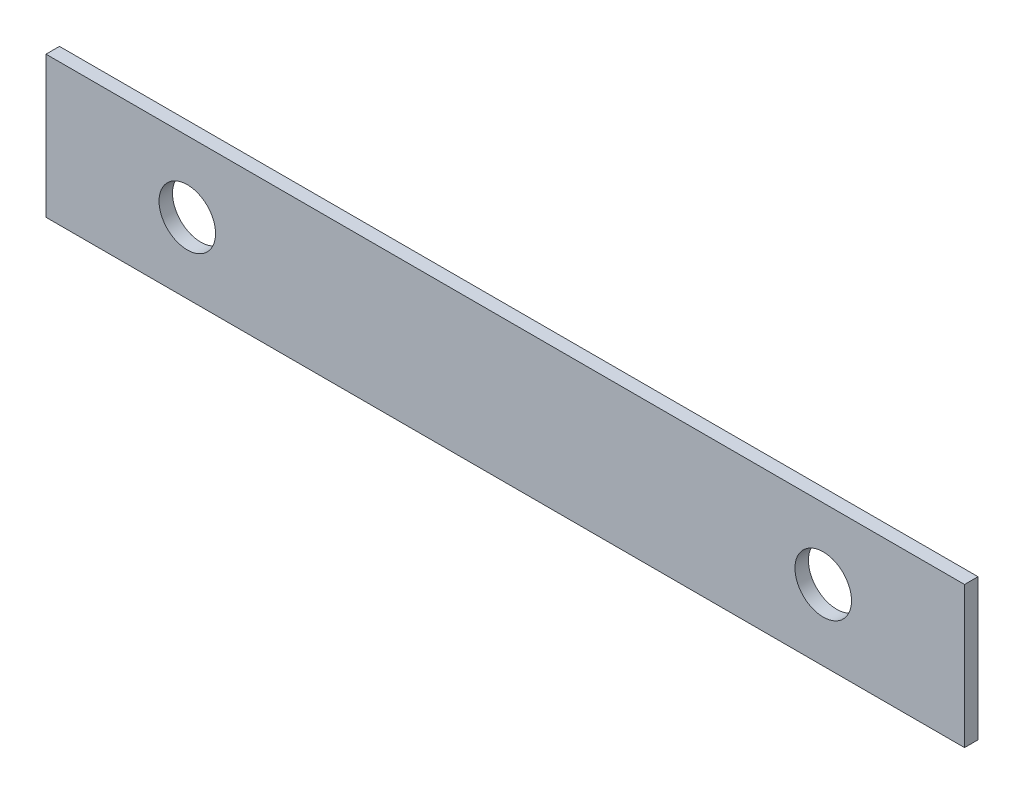
ISO-10303-21;
HEADER;
FILE_DESCRIPTION(('STEP AP214'),'2;1');
FILE_NAME('part.step','',(''),(''),'','','');
FILE_SCHEMA(('AUTOMOTIVE_DESIGN { 1 0 10303 214 1 1 1 1 }'));
ENDSEC;
DATA;
#1=APPLICATION_CONTEXT('core data for automotive mechanical design processes');
#2=APPLICATION_PROTOCOL_DEFINITION('international standard','automotive_design',2000,#1);
#3=PRODUCT_CONTEXT('',#1,'mechanical');
#4=PRODUCT('Part','Part','',(#3));
#5=PRODUCT_RELATED_PRODUCT_CATEGORY('part','',(#4));
#6=PRODUCT_DEFINITION_FORMATION('','',#4);
#7=PRODUCT_DEFINITION_CONTEXT('part definition',#1,'design');
#8=PRODUCT_DEFINITION('design','',#6,#7);
#9=PRODUCT_DEFINITION_SHAPE('','',#8);
#10=(LENGTH_UNIT() NAMED_UNIT(*) SI_UNIT(.MILLI.,.METRE.));
#11=(NAMED_UNIT(*) PLANE_ANGLE_UNIT() SI_UNIT($,.RADIAN.));
#12=(NAMED_UNIT(*) SI_UNIT($,.STERADIAN.) SOLID_ANGLE_UNIT());
#13=UNCERTAINTY_MEASURE_WITH_UNIT(LENGTH_MEASURE(1.E-05),#10,'distance_accuracy_value','');
#14=(GEOMETRIC_REPRESENTATION_CONTEXT(3) GLOBAL_UNCERTAINTY_ASSIGNED_CONTEXT((#13)) GLOBAL_UNIT_ASSIGNED_CONTEXT((#10,
#11,#12)) REPRESENTATION_CONTEXT('',''));
#15=CARTESIAN_POINT('',(0.,0.,0.));
#16=DIRECTION('',(0.,0.,1.));
#17=DIRECTION('',(1.,0.,0.));
#18=AXIS2_PLACEMENT_3D('',#15,#16,#17);
#19=CARTESIAN_POINT('',(324.999999999999,-50.0000000000003,4.765));
#20=DIRECTION('',(-1.,0.,0.));
#21=DIRECTION('',(0.,0.,1.));
#22=AXIS2_PLACEMENT_3D('',#19,#20,#21);
#23=PLANE('',#22);
#24=DIRECTION('',(0.,1.,0.));
#25=VECTOR('',#24,1.);
#26=CARTESIAN_POINT('',(324.999999999999,-50.0000000000003,-4.765));
#27=LINE('',#26,#25);
#28=CARTESIAN_POINT('',(324.999999999999,-50.0000000000003,-4.765));
#29=VERTEX_POINT('',#28);
#30=CARTESIAN_POINT('',(324.999999999999,49.9999999999998,-4.765));
#31=VERTEX_POINT('',#30);
#32=EDGE_CURVE('E99',#29,#31,#27,.T.);
#33=ORIENTED_EDGE('',*,*,#32,.T.);
#34=DIRECTION('',(0.,0.,-1.));
#35=VECTOR('',#34,1.);
#36=CARTESIAN_POINT('',(324.999999999999,49.9999999999998,4.765));
#37=LINE('',#36,#35);
#38=CARTESIAN_POINT('',(324.999999999999,49.9999999999998,4.765));
#39=VERTEX_POINT('',#38);
#40=EDGE_CURVE('E11',#39,#31,#37,.T.);
#41=ORIENTED_EDGE('',*,*,#40,.F.);
#42=DIRECTION('',(0.,1.,0.));
#43=VECTOR('',#42,1.);
#44=CARTESIAN_POINT('',(324.999999999999,-50.0000000000003,4.765));
#45=LINE('',#44,#43);
#46=CARTESIAN_POINT('',(324.999999999999,-50.0000000000003,4.765));
#47=VERTEX_POINT('',#46);
#48=EDGE_CURVE('E86',#47,#39,#45,.T.);
#49=ORIENTED_EDGE('',*,*,#48,.F.);
#50=DIRECTION('',(0.,0.,-1.));
#51=VECTOR('',#50,1.);
#52=CARTESIAN_POINT('',(324.999999999999,-50.0000000000003,4.765));
#53=LINE('',#52,#51);
#54=EDGE_CURVE('E95',#47,#29,#53,.T.);
#55=ORIENTED_EDGE('',*,*,#54,.T.);
#56=EDGE_LOOP('',(#33,#41,#49,#55));
#57=FACE_BOUND('',#56,.T.);
#58=ADVANCED_FACE('F34',(#57),#23,.F.);
#59=CARTESIAN_POINT('',(-325.000000000001,49.9999999999998,4.765));
#60=DIRECTION('',(0.,-1.,0.));
#61=DIRECTION('',(0.,0.,-1.));
#62=AXIS2_PLACEMENT_3D('',#59,#60,#61);
#63=PLANE('',#62);
#64=DIRECTION('',(-1.,0.,0.));
#65=VECTOR('',#64,1.);
#66=CARTESIAN_POINT('',(-325.000000000001,49.9999999999998,-4.765));
#67=LINE('',#66,#65);
#68=CARTESIAN_POINT('',(-325.000000000001,49.9999999999998,-4.765));
#69=VERTEX_POINT('',#68);
#70=EDGE_CURVE('E90',#31,#69,#67,.T.);
#71=ORIENTED_EDGE('',*,*,#70,.T.);
#72=DIRECTION('',(0.,0.,-1.));
#73=VECTOR('',#72,1.);
#74=CARTESIAN_POINT('',(-325.000000000001,49.9999999999998,4.765));
#75=LINE('',#74,#73);
#76=CARTESIAN_POINT('',(-325.000000000001,49.9999999999998,4.765));
#77=VERTEX_POINT('',#76);
#78=EDGE_CURVE('E43',#77,#69,#75,.T.);
#79=ORIENTED_EDGE('',*,*,#78,.F.);
#80=DIRECTION('',(-1.,0.,0.));
#81=VECTOR('',#80,1.);
#82=CARTESIAN_POINT('',(-325.000000000001,49.9999999999998,4.765));
#83=LINE('',#82,#81);
#84=EDGE_CURVE('E81',#39,#77,#83,.T.);
#85=ORIENTED_EDGE('',*,*,#84,.F.);
#86=ORIENTED_EDGE('',*,*,#40,.T.);
#87=EDGE_LOOP('',(#71,#79,#85,#86));
#88=FACE_BOUND('',#87,.T.);
#89=ADVANCED_FACE('F89',(#88),#63,.F.);
#90=CARTESIAN_POINT('',(-325.000000000001,-50.0000000000003,4.765));
#91=DIRECTION('',(1.,0.,0.));
#92=DIRECTION('',(0.,0.,-1.));
#93=AXIS2_PLACEMENT_3D('',#90,#91,#92);
#94=PLANE('',#93);
#95=DIRECTION('',(0.,-1.,0.));
#96=VECTOR('',#95,1.);
#97=CARTESIAN_POINT('',(-325.000000000001,-50.0000000000003,-4.765));
#98=LINE('',#97,#96);
#99=CARTESIAN_POINT('',(-325.000000000001,-50.0000000000003,-4.765));
#100=VERTEX_POINT('',#99);
#101=EDGE_CURVE('E68',#69,#100,#98,.T.);
#102=ORIENTED_EDGE('',*,*,#101,.T.);
#103=DIRECTION('',(0.,0.,-1.));
#104=VECTOR('',#103,1.);
#105=CARTESIAN_POINT('',(-325.000000000001,-50.0000000000003,4.765));
#106=LINE('',#105,#104);
#107=CARTESIAN_POINT('',(-325.000000000001,-50.0000000000003,4.765));
#108=VERTEX_POINT('',#107);
#109=EDGE_CURVE('E91',#108,#100,#106,.T.);
#110=ORIENTED_EDGE('',*,*,#109,.F.);
#111=DIRECTION('',(0.,-1.,0.));
#112=VECTOR('',#111,1.);
#113=CARTESIAN_POINT('',(-325.000000000001,-50.0000000000003,4.765));
#114=LINE('',#113,#112);
#115=EDGE_CURVE('E84',#77,#108,#114,.T.);
#116=ORIENTED_EDGE('',*,*,#115,.F.);
#117=ORIENTED_EDGE('',*,*,#78,.T.);
#118=EDGE_LOOP('',(#102,#110,#116,#117));
#119=FACE_BOUND('',#118,.T.);
#120=ADVANCED_FACE('F93',(#119),#94,.F.);
#121=CARTESIAN_POINT('',(-325.000000000001,-50.0000000000003,4.765));
#122=DIRECTION('',(0.,1.,0.));
#123=DIRECTION('',(0.,0.,1.));
#124=AXIS2_PLACEMENT_3D('',#121,#122,#123);
#125=PLANE('',#124);
#126=DIRECTION('',(1.,0.,0.));
#127=VECTOR('',#126,1.);
#128=CARTESIAN_POINT('',(-325.000000000001,-50.0000000000003,-4.765));
#129=LINE('',#128,#127);
#130=EDGE_CURVE('E74',#100,#29,#129,.T.);
#131=ORIENTED_EDGE('',*,*,#130,.T.);
#132=ORIENTED_EDGE('',*,*,#54,.F.);
#133=DIRECTION('',(1.,0.,0.));
#134=VECTOR('',#133,1.);
#135=CARTESIAN_POINT('',(-325.000000000001,-50.0000000000003,4.765));
#136=LINE('',#135,#134);
#137=EDGE_CURVE('E51',#108,#47,#136,.T.);
#138=ORIENTED_EDGE('',*,*,#137,.F.);
#139=ORIENTED_EDGE('',*,*,#109,.T.);
#140=EDGE_LOOP('',(#131,#132,#138,#139));
#141=FACE_BOUND('',#140,.T.);
#142=ADVANCED_FACE('F107',(#141),#125,.F.);
#143=CARTESIAN_POINT('',(0.,0.,4.765));
#144=DIRECTION('',(0.,0.,-1.));
#145=DIRECTION('',(-1.,0.,0.));
#146=AXIS2_PLACEMENT_3D('',#143,#144,#145);
#147=PLANE('',#146);
#148=CARTESIAN_POINT('',(224.999999999999,0.,4.765));
#149=DIRECTION('',(0.,0.,1.));
#150=DIRECTION('',(1.,0.,0.));
#151=AXIS2_PLACEMENT_3D('',#148,#149,#150);
#152=CIRCLE('',#151,20.);
#153=CARTESIAN_POINT('',(244.999999999999,0.,4.765));
#154=VERTEX_POINT('',#153);
#155=EDGE_CURVE('E118',#154,#154,#152,.T.);
#156=ORIENTED_EDGE('',*,*,#155,.F.);
#157=EDGE_LOOP('',(#156));
#158=FACE_BOUND('',#157,.T.);
#159=CARTESIAN_POINT('',(-225.000000000001,0.,4.765));
#160=DIRECTION('',(0.,0.,-1.));
#161=DIRECTION('',(-1.,0.,0.));
#162=AXIS2_PLACEMENT_3D('',#159,#160,#161);
#163=CIRCLE('',#162,20.);
#164=CARTESIAN_POINT('',(-245.000000000001,0.,4.765));
#165=VERTEX_POINT('',#164);
#166=EDGE_CURVE('E102',#165,#165,#163,.T.);
#167=ORIENTED_EDGE('',*,*,#166,.T.);
#168=EDGE_LOOP('',(#167));
#169=FACE_BOUND('',#168,.T.);
#170=ORIENTED_EDGE('',*,*,#48,.T.);
#171=ORIENTED_EDGE('',*,*,#84,.T.);
#172=ORIENTED_EDGE('',*,*,#115,.T.);
#173=ORIENTED_EDGE('',*,*,#137,.T.);
#174=EDGE_LOOP('',(#170,#171,#172,#173));
#175=FACE_BOUND('',#174,.T.);
#176=ADVANCED_FACE('F82',(#158,#169,#175),#147,.F.);
#177=CARTESIAN_POINT('',(0.,0.,-4.765));
#178=DIRECTION('',(0.,0.,-1.));
#179=DIRECTION('',(-1.,0.,0.));
#180=AXIS2_PLACEMENT_3D('',#177,#178,#179);
#181=PLANE('',#180);
#182=CARTESIAN_POINT('',(224.999999999999,0.,-4.765));
#183=DIRECTION('',(0.,0.,-1.));
#184=DIRECTION('',(-1.,0.,0.));
#185=AXIS2_PLACEMENT_3D('',#182,#183,#184);
#186=CIRCLE('',#185,20.);
#187=CARTESIAN_POINT('',(204.999999999999,0.,-4.765));
#188=VERTEX_POINT('',#187);
#189=EDGE_CURVE('E37',#188,#188,#186,.T.);
#190=ORIENTED_EDGE('',*,*,#189,.F.);
#191=EDGE_LOOP('',(#190));
#192=FACE_BOUND('',#191,.T.);
#193=CARTESIAN_POINT('',(-225.000000000001,0.,-4.765));
#194=DIRECTION('',(0.,0.,-1.));
#195=DIRECTION('',(-1.,0.,0.));
#196=AXIS2_PLACEMENT_3D('',#193,#194,#195);
#197=CIRCLE('',#196,20.);
#198=CARTESIAN_POINT('',(-245.000000000001,0.,-4.765));
#199=VERTEX_POINT('',#198);
#200=EDGE_CURVE('E115',#199,#199,#197,.T.);
#201=ORIENTED_EDGE('',*,*,#200,.F.);
#202=EDGE_LOOP('',(#201));
#203=FACE_BOUND('',#202,.T.);
#204=ORIENTED_EDGE('',*,*,#32,.F.);
#205=ORIENTED_EDGE('',*,*,#130,.F.);
#206=ORIENTED_EDGE('',*,*,#101,.F.);
#207=ORIENTED_EDGE('',*,*,#70,.F.);
#208=EDGE_LOOP('',(#204,#205,#206,#207));
#209=FACE_BOUND('',#208,.T.);
#210=ADVANCED_FACE('F110',(#192,#203,#209),#181,.T.);
#211=CARTESIAN_POINT('',(-225.000000000001,0.,10.235));
#212=DIRECTION('',(0.,0.,-1.));
#213=DIRECTION('',(-1.,0.,0.));
#214=AXIS2_PLACEMENT_3D('',#211,#212,#213);
#215=CYLINDRICAL_SURFACE('',#214,20.);
#216=ORIENTED_EDGE('',*,*,#200,.T.);
#217=EDGE_LOOP('',(#216));
#218=FACE_BOUND('',#217,.T.);
#219=ORIENTED_EDGE('',*,*,#166,.F.);
#220=EDGE_LOOP('',(#219));
#221=FACE_BOUND('',#220,.T.);
#222=ADVANCED_FACE('F129',(#218,#221),#215,.F.);
#223=CARTESIAN_POINT('',(224.999999999999,0.,-10.235));
#224=DIRECTION('',(0.,0.,1.));
#225=DIRECTION('',(1.,0.,0.));
#226=AXIS2_PLACEMENT_3D('',#223,#224,#225);
#227=CYLINDRICAL_SURFACE('',#226,20.);
#228=ORIENTED_EDGE('',*,*,#189,.T.);
#229=EDGE_LOOP('',(#228));
#230=FACE_BOUND('',#229,.T.);
#231=ORIENTED_EDGE('',*,*,#155,.T.);
#232=EDGE_LOOP('',(#231));
#233=FACE_BOUND('',#232,.T.);
#234=ADVANCED_FACE('F125',(#230,#233),#227,.F.);
#235=CLOSED_SHELL('',(#58,#89,#120,#142,#176,#210,#222,#234));
#236=MANIFOLD_SOLID_BREP('B2',#235);
#237=ADVANCED_BREP_SHAPE_REPRESENTATION('',(#18,#236),#14);
#238=SHAPE_DEFINITION_REPRESENTATION(#9,#237);
ENDSEC;
END-ISO-10303-21;
